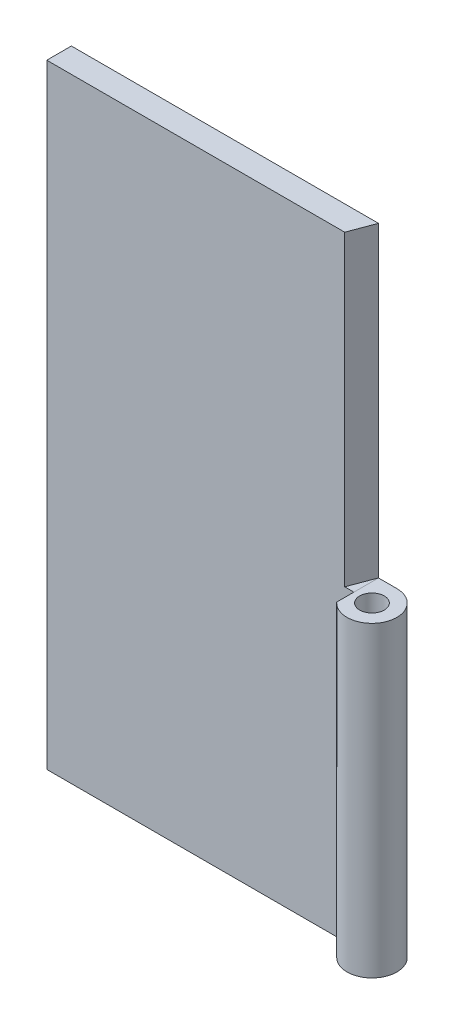
ISO-10303-21;
HEADER;
FILE_DESCRIPTION(('STEP AP214'),'2;1');
FILE_NAME('part.step','',(''),(''),'','','');
FILE_SCHEMA(('AUTOMOTIVE_DESIGN { 1 0 10303 214 1 1 1 1 }'));
ENDSEC;
DATA;
#1=APPLICATION_CONTEXT('core data for automotive mechanical design processes');
#2=APPLICATION_PROTOCOL_DEFINITION('international standard','automotive_design',2000,#1);
#3=PRODUCT_CONTEXT('',#1,'mechanical');
#4=PRODUCT('Part','Part','',(#3));
#5=PRODUCT_RELATED_PRODUCT_CATEGORY('part','',(#4));
#6=PRODUCT_DEFINITION_FORMATION('','',#4);
#7=PRODUCT_DEFINITION_CONTEXT('part definition',#1,'design');
#8=PRODUCT_DEFINITION('design','',#6,#7);
#9=PRODUCT_DEFINITION_SHAPE('','',#8);
#10=(LENGTH_UNIT() NAMED_UNIT(*) SI_UNIT(.MILLI.,.METRE.));
#11=(NAMED_UNIT(*) PLANE_ANGLE_UNIT() SI_UNIT($,.RADIAN.));
#12=(NAMED_UNIT(*) SI_UNIT($,.STERADIAN.) SOLID_ANGLE_UNIT());
#13=UNCERTAINTY_MEASURE_WITH_UNIT(LENGTH_MEASURE(1.E-05),#10,'distance_accuracy_value','');
#14=(GEOMETRIC_REPRESENTATION_CONTEXT(3) GLOBAL_UNCERTAINTY_ASSIGNED_CONTEXT((#13)) GLOBAL_UNIT_ASSIGNED_CONTEXT((#10,
#11,#12)) REPRESENTATION_CONTEXT('',''));
#15=CARTESIAN_POINT('',(0.,0.,0.));
#16=DIRECTION('',(0.,0.,1.));
#17=DIRECTION('',(1.,0.,0.));
#18=AXIS2_PLACEMENT_3D('',#15,#16,#17);
#19=CARTESIAN_POINT('',(25.,-25.,3.4));
#20=DIRECTION('',(-1.,0.,0.));
#21=DIRECTION('',(0.,0.,1.));
#22=AXIS2_PLACEMENT_3D('',#19,#20,#21);
#23=PLANE('',#22);
#24=DIRECTION('',(0.,0.,-1.));
#25=VECTOR('',#24,1.);
#26=CARTESIAN_POINT('',(25.,-50.,3.4));
#27=LINE('',#26,#25);
#28=CARTESIAN_POINT('',(25.,-50.,3.4));
#29=VERTEX_POINT('',#28);
#30=CARTESIAN_POINT('',(25.,-50.,0.));
#31=VERTEX_POINT('',#30);
#32=EDGE_CURVE('E104',#29,#31,#27,.T.);
#33=ORIENTED_EDGE('',*,*,#32,.F.);
#34=DIRECTION('',(0.,-1.,0.));
#35=VECTOR('',#34,1.);
#36=CARTESIAN_POINT('',(25.,-25.,3.4));
#37=LINE('',#36,#35);
#38=CARTESIAN_POINT('',(25.,-25.,3.4));
#39=VERTEX_POINT('',#38);
#40=EDGE_CURVE('E12',#39,#29,#37,.T.);
#41=ORIENTED_EDGE('',*,*,#40,.F.);
#42=DIRECTION('',(0.,0.,-1.));
#43=VECTOR('',#42,1.);
#44=CARTESIAN_POINT('',(25.,-25.,3.4));
#45=LINE('',#44,#43);
#46=CARTESIAN_POINT('',(25.,-25.,0.));
#47=VERTEX_POINT('',#46);
#48=EDGE_CURVE('E93',#39,#47,#45,.T.);
#49=ORIENTED_EDGE('',*,*,#48,.T.);
#50=DIRECTION('',(0.,-1.,0.));
#51=VECTOR('',#50,1.);
#52=CARTESIAN_POINT('',(25.,-25.,0.));
#53=LINE('',#52,#51);
#54=EDGE_CURVE('E52',#47,#31,#53,.T.);
#55=ORIENTED_EDGE('',*,*,#54,.T.);
#56=EDGE_LOOP('',(#33,#41,#49,#55));
#57=FACE_BOUND('',#56,.T.);
#58=ADVANCED_FACE('F49',(#57),#23,.T.);
#59=CARTESIAN_POINT('',(26.5,-25.,2.03088235294118));
#60=DIRECTION('',(0.,-1.,0.));
#61=DIRECTION('',(0.,0.,-1.));
#62=AXIS2_PLACEMENT_3D('',#59,#60,#61);
#63=CYLINDRICAL_SURFACE('',#62,2.03088235294118);
#64=CARTESIAN_POINT('',(26.5,-50.,2.03088235294118));
#65=DIRECTION('',(0.,-1.,0.));
#66=DIRECTION('',(0.,0.,-1.));
#67=AXIS2_PLACEMENT_3D('',#64,#65,#66);
#68=CIRCLE('',#67,2.03088235294118);
#69=CARTESIAN_POINT('',(26.5,-50.,0.));
#70=VERTEX_POINT('',#69);
#71=EDGE_CURVE('E95',#70,#29,#68,.T.);
#72=ORIENTED_EDGE('',*,*,#71,.F.);
#73=DIRECTION('',(0.,-1.,0.));
#74=VECTOR('',#73,1.);
#75=CARTESIAN_POINT('',(26.5,-25.,0.));
#76=LINE('',#75,#74);
#77=CARTESIAN_POINT('',(26.5,-25.,0.));
#78=VERTEX_POINT('',#77);
#79=EDGE_CURVE('E58',#78,#70,#76,.T.);
#80=ORIENTED_EDGE('',*,*,#79,.F.);
#81=CARTESIAN_POINT('',(26.5,-25.,2.03088235294118));
#82=DIRECTION('',(0.,-1.,0.));
#83=DIRECTION('',(0.,0.,-1.));
#84=AXIS2_PLACEMENT_3D('',#81,#82,#83);
#85=CIRCLE('',#84,2.03088235294118);
#86=EDGE_CURVE('E90',#78,#39,#85,.T.);
#87=ORIENTED_EDGE('',*,*,#86,.T.);
#88=ORIENTED_EDGE('',*,*,#40,.T.);
#89=EDGE_LOOP('',(#72,#80,#87,#88));
#90=FACE_BOUND('',#89,.T.);
#91=ADVANCED_FACE('F108',(#90),#63,.T.);
#92=CARTESIAN_POINT('',(25.,-25.,0.));
#93=DIRECTION('',(0.,0.,-1.));
#94=DIRECTION('',(-1.,0.,0.));
#95=AXIS2_PLACEMENT_3D('',#92,#93,#94);
#96=PLANE('',#95);
#97=DIRECTION('',(1.,0.,0.));
#98=VECTOR('',#97,1.);
#99=CARTESIAN_POINT('',(25.,-50.,0.));
#100=LINE('',#99,#98);
#101=EDGE_CURVE('E88',#31,#70,#100,.T.);
#102=ORIENTED_EDGE('',*,*,#101,.F.);
#103=ORIENTED_EDGE('',*,*,#54,.F.);
#104=DIRECTION('',(1.,0.,0.));
#105=VECTOR('',#104,1.);
#106=CARTESIAN_POINT('',(25.,-25.,0.));
#107=LINE('',#106,#105);
#108=EDGE_CURVE('E86',#47,#78,#107,.T.);
#109=ORIENTED_EDGE('',*,*,#108,.T.);
#110=ORIENTED_EDGE('',*,*,#79,.T.);
#111=EDGE_LOOP('',(#102,#103,#109,#110));
#112=FACE_BOUND('',#111,.T.);
#113=ADVANCED_FACE('F85',(#112),#96,.T.);
#114=CARTESIAN_POINT('',(26.5,-25.,2.03088235294118));
#115=DIRECTION('',(0.,-1.,0.));
#116=DIRECTION('',(0.,0.,-1.));
#117=AXIS2_PLACEMENT_3D('',#114,#115,#116);
#118=PLANE('',#117);
#119=CARTESIAN_POINT('',(26.5,-25.,2.03088235294118));
#120=DIRECTION('',(0.,-1.,0.));
#121=DIRECTION('',(0.,0.,-1.));
#122=AXIS2_PLACEMENT_3D('',#119,#120,#121);
#123=CIRCLE('',#122,1.);
#124=CARTESIAN_POINT('',(26.5,-25.,1.03088235294118));
#125=VERTEX_POINT('',#124);
#126=EDGE_CURVE('E100',#125,#125,#123,.T.);
#127=ORIENTED_EDGE('',*,*,#126,.T.);
#128=EDGE_LOOP('',(#127));
#129=FACE_BOUND('',#128,.T.);
#130=ORIENTED_EDGE('',*,*,#48,.F.);
#131=ORIENTED_EDGE('',*,*,#86,.F.);
#132=ORIENTED_EDGE('',*,*,#108,.F.);
#133=EDGE_LOOP('',(#130,#131,#132));
#134=FACE_BOUND('',#133,.T.);
#135=ADVANCED_FACE('F92',(#129,#134),#118,.F.);
#136=CARTESIAN_POINT('',(26.5,-50.,2.03088235294118));
#137=DIRECTION('',(0.,-1.,0.));
#138=DIRECTION('',(0.,0.,-1.));
#139=AXIS2_PLACEMENT_3D('',#136,#137,#138);
#140=PLANE('',#139);
#141=CARTESIAN_POINT('',(26.5,-50.,2.03088235294118));
#142=DIRECTION('',(0.,-1.,0.));
#143=DIRECTION('',(0.,0.,-1.));
#144=AXIS2_PLACEMENT_3D('',#141,#142,#143);
#145=CIRCLE('',#144,1.);
#146=CARTESIAN_POINT('',(26.5,-50.,1.03088235294118));
#147=VERTEX_POINT('',#146);
#148=EDGE_CURVE('E130',#147,#147,#145,.T.);
#149=ORIENTED_EDGE('',*,*,#148,.F.);
#150=EDGE_LOOP('',(#149));
#151=FACE_BOUND('',#150,.T.);
#152=ORIENTED_EDGE('',*,*,#32,.T.);
#153=ORIENTED_EDGE('',*,*,#101,.T.);
#154=ORIENTED_EDGE('',*,*,#71,.T.);
#155=EDGE_LOOP('',(#152,#153,#154));
#156=FACE_BOUND('',#155,.T.);
#157=ADVANCED_FACE('F107',(#151,#156),#140,.T.);
#158=CARTESIAN_POINT('',(26.5,0.,2.03088235294118));
#159=DIRECTION('',(0.,-1.,0.));
#160=DIRECTION('',(0.,0.,-1.));
#161=AXIS2_PLACEMENT_3D('',#158,#159,#160);
#162=CYLINDRICAL_SURFACE('',#161,1.);
#163=ORIENTED_EDGE('',*,*,#148,.T.);
#164=EDGE_LOOP('',(#163));
#165=FACE_BOUND('',#164,.T.);
#166=ORIENTED_EDGE('',*,*,#126,.F.);
#167=EDGE_LOOP('',(#166));
#168=FACE_BOUND('',#167,.T.);
#169=ADVANCED_FACE('F118',(#165,#168),#162,.F.);
#170=CLOSED_SHELL('',(#58,#91,#113,#135,#157,#169));
#171=MANIFOLD_SOLID_BREP('B2',#170);
#172=CARTESIAN_POINT('',(0.,0.,2.));
#173=DIRECTION('',(1.,0.,0.));
#174=DIRECTION('',(0.,1.,0.));
#175=AXIS2_PLACEMENT_3D('',#172,#173,#174);
#176=PLANE('',#175);
#177=DIRECTION('',(0.,-1.,0.));
#178=VECTOR('',#177,1.);
#179=CARTESIAN_POINT('',(0.,0.,0.));
#180=LINE('',#179,#178);
#181=CARTESIAN_POINT('',(0.,0.,0.));
#182=VERTEX_POINT('',#181);
#183=CARTESIAN_POINT('',(0.,-50.,0.));
#184=VERTEX_POINT('',#183);
#185=EDGE_CURVE('E253',#182,#184,#180,.T.);
#186=ORIENTED_EDGE('',*,*,#185,.T.);
#187=DIRECTION('',(0.,0.,-1.));
#188=VECTOR('',#187,1.);
#189=CARTESIAN_POINT('',(0.,-50.,2.));
#190=LINE('',#189,#188);
#191=CARTESIAN_POINT('',(0.,-50.,2.));
#192=VERTEX_POINT('',#191);
#193=EDGE_CURVE('E47',#192,#184,#190,.T.);
#194=ORIENTED_EDGE('',*,*,#193,.F.);
#195=DIRECTION('',(0.,-1.,0.));
#196=VECTOR('',#195,1.);
#197=CARTESIAN_POINT('',(0.,0.,2.));
#198=LINE('',#197,#196);
#199=CARTESIAN_POINT('',(0.,0.,2.));
#200=VERTEX_POINT('',#199);
#201=EDGE_CURVE('E265',#200,#192,#198,.T.);
#202=ORIENTED_EDGE('',*,*,#201,.F.);
#203=DIRECTION('',(0.,0.,-1.));
#204=VECTOR('',#203,1.);
#205=CARTESIAN_POINT('',(0.,0.,2.));
#206=LINE('',#205,#204);
#207=EDGE_CURVE('E242',#200,#182,#206,.T.);
#208=ORIENTED_EDGE('',*,*,#207,.T.);
#209=EDGE_LOOP('',(#186,#194,#202,#208));
#210=FACE_BOUND('',#209,.T.);
#211=ADVANCED_FACE('F168',(#210),#176,.F.);
#212=CARTESIAN_POINT('',(0.,-50.,2.));
#213=DIRECTION('',(0.,1.,0.));
#214=DIRECTION('',(0.,0.,1.));
#215=AXIS2_PLACEMENT_3D('',#212,#213,#214);
#216=PLANE('',#215);
#217=DIRECTION('',(1.,0.,0.));
#218=VECTOR('',#217,1.);
#219=CARTESIAN_POINT('',(0.,-50.,0.));
#220=LINE('',#219,#218);
#221=CARTESIAN_POINT('',(25.,-50.,0.));
#222=VERTEX_POINT('',#221);
#223=EDGE_CURVE('E257',#184,#222,#220,.T.);
#224=ORIENTED_EDGE('',*,*,#223,.T.);
#225=DIRECTION('',(0.,0.,-1.));
#226=VECTOR('',#225,1.);
#227=CARTESIAN_POINT('',(25.,-50.,2.));
#228=LINE('',#227,#226);
#229=CARTESIAN_POINT('',(25.,-50.,2.));
#230=VERTEX_POINT('',#229);
#231=EDGE_CURVE('E176',#230,#222,#228,.T.);
#232=ORIENTED_EDGE('',*,*,#231,.F.);
#233=DIRECTION('',(1.,0.,0.));
#234=VECTOR('',#233,1.);
#235=CARTESIAN_POINT('',(0.,-50.,2.));
#236=LINE('',#235,#234);
#237=EDGE_CURVE('E215',#192,#230,#236,.T.);
#238=ORIENTED_EDGE('',*,*,#237,.F.);
#239=ORIENTED_EDGE('',*,*,#193,.T.);
#240=EDGE_LOOP('',(#224,#232,#238,#239));
#241=FACE_BOUND('',#240,.T.);
#242=ADVANCED_FACE('F286',(#241),#216,.F.);
#243=CARTESIAN_POINT('',(25.,0.,2.));
#244=DIRECTION('',(-1.,0.,0.));
#245=DIRECTION('',(0.,-1.,0.));
#246=AXIS2_PLACEMENT_3D('',#243,#244,#245);
#247=PLANE('',#246);
#248=DIRECTION('',(0.,1.,0.));
#249=VECTOR('',#248,1.);
#250=CARTESIAN_POINT('',(25.,0.,0.));
#251=LINE('',#250,#249);
#252=CARTESIAN_POINT('',(25.,-25.,0.));
#253=VERTEX_POINT('',#252);
#254=EDGE_CURVE('E260',#222,#253,#251,.T.);
#255=ORIENTED_EDGE('',*,*,#254,.T.);
#256=DIRECTION('',(0.,0.,-1.));
#257=VECTOR('',#256,1.);
#258=CARTESIAN_POINT('',(25.,-25.,2.));
#259=LINE('',#258,#257);
#260=CARTESIAN_POINT('',(25.,-25.,2.));
#261=VERTEX_POINT('',#260);
#262=EDGE_CURVE('E183',#261,#253,#259,.T.);
#263=ORIENTED_EDGE('',*,*,#262,.F.);
#264=DIRECTION('',(0.,1.,0.));
#265=VECTOR('',#264,1.);
#266=CARTESIAN_POINT('',(25.,0.,2.));
#267=LINE('',#266,#265);
#268=EDGE_CURVE('E245',#230,#261,#267,.T.);
#269=ORIENTED_EDGE('',*,*,#268,.F.);
#270=ORIENTED_EDGE('',*,*,#231,.T.);
#271=EDGE_LOOP('',(#255,#263,#269,#270));
#272=FACE_BOUND('',#271,.T.);
#273=ADVANCED_FACE('F271',(#272),#247,.F.);
#274=CARTESIAN_POINT('',(0.,0.,2.));
#275=DIRECTION('',(0.,-1.,0.));
#276=DIRECTION('',(0.,0.,-1.));
#277=AXIS2_PLACEMENT_3D('',#274,#275,#276);
#278=PLANE('',#277);
#279=DIRECTION('',(-1.,0.,0.));
#280=VECTOR('',#279,1.);
#281=CARTESIAN_POINT('',(0.,0.,2.));
#282=LINE('',#281,#280);
#283=CARTESIAN_POINT('',(24.25,0.,2.));
#284=VERTEX_POINT('',#283);
#285=EDGE_CURVE('E192',#284,#200,#282,.T.);
#286=ORIENTED_EDGE('',*,*,#285,.F.);
#287=DIRECTION('',(-0.351123441588392,0.,0.936329177569045));
#288=VECTOR('',#287,1.);
#289=CARTESIAN_POINT('',(25.,0.,0.));
#290=LINE('',#289,#288);
#291=CARTESIAN_POINT('',(25.,0.,0.));
#292=VERTEX_POINT('',#291);
#293=EDGE_CURVE('E227',#292,#284,#290,.T.);
#294=ORIENTED_EDGE('',*,*,#293,.F.);
#295=DIRECTION('',(-1.,0.,0.));
#296=VECTOR('',#295,1.);
#297=CARTESIAN_POINT('',(0.,0.,0.));
#298=LINE('',#297,#296);
#299=EDGE_CURVE('E210',#292,#182,#298,.T.);
#300=ORIENTED_EDGE('',*,*,#299,.T.);
#301=ORIENTED_EDGE('',*,*,#207,.F.);
#302=EDGE_LOOP('',(#286,#294,#300,#301));
#303=FACE_BOUND('',#302,.T.);
#304=ADVANCED_FACE('F241',(#303),#278,.F.);
#305=CARTESIAN_POINT('',(0.,0.,2.));
#306=DIRECTION('',(0.,0.,1.));
#307=DIRECTION('',(1.,0.,0.));
#308=AXIS2_PLACEMENT_3D('',#305,#306,#307);
#309=PLANE('',#308);
#310=DIRECTION('',(1.,0.,0.));
#311=VECTOR('',#310,1.);
#312=CARTESIAN_POINT('',(24.25,-25.,2.));
#313=LINE('',#312,#311);
#314=CARTESIAN_POINT('',(24.25,-25.,2.));
#315=VERTEX_POINT('',#314);
#316=EDGE_CURVE('E237',#315,#261,#313,.T.);
#317=ORIENTED_EDGE('',*,*,#316,.F.);
#318=DIRECTION('',(0.,1.,0.));
#319=VECTOR('',#318,1.);
#320=CARTESIAN_POINT('',(24.25,-27.1360009363294,2.));
#321=LINE('',#320,#319);
#322=EDGE_CURVE('E229',#315,#284,#321,.T.);
#323=ORIENTED_EDGE('',*,*,#322,.T.);
#324=ORIENTED_EDGE('',*,*,#285,.T.);
#325=ORIENTED_EDGE('',*,*,#201,.T.);
#326=ORIENTED_EDGE('',*,*,#237,.T.);
#327=ORIENTED_EDGE('',*,*,#268,.T.);
#328=EDGE_LOOP('',(#317,#323,#324,#325,#326,#327));
#329=FACE_BOUND('',#328,.T.);
#330=ADVANCED_FACE('F235',(#329),#309,.T.);
#331=CARTESIAN_POINT('',(0.,0.,0.));
#332=DIRECTION('',(0.,0.,1.));
#333=DIRECTION('',(1.,0.,0.));
#334=AXIS2_PLACEMENT_3D('',#331,#332,#333);
#335=PLANE('',#334);
#336=ORIENTED_EDGE('',*,*,#185,.F.);
#337=ORIENTED_EDGE('',*,*,#299,.F.);
#338=DIRECTION('',(0.,1.,0.));
#339=VECTOR('',#338,1.);
#340=CARTESIAN_POINT('',(25.,-27.1360009363294,0.));
#341=LINE('',#340,#339);
#342=EDGE_CURVE('E231',#253,#292,#341,.T.);
#343=ORIENTED_EDGE('',*,*,#342,.F.);
#344=ORIENTED_EDGE('',*,*,#254,.F.);
#345=ORIENTED_EDGE('',*,*,#223,.F.);
#346=EDGE_LOOP('',(#336,#337,#343,#344,#345));
#347=FACE_BOUND('',#346,.T.);
#348=ADVANCED_FACE('F274',(#347),#335,.F.);
#349=CARTESIAN_POINT('',(26.5,-25.,2.03088235294118));
#350=DIRECTION('',(0.,-1.,0.));
#351=DIRECTION('',(0.,0.,-1.));
#352=AXIS2_PLACEMENT_3D('',#349,#350,#351);
#353=PLANE('',#352);
#354=ORIENTED_EDGE('',*,*,#316,.T.);
#355=ORIENTED_EDGE('',*,*,#262,.T.);
#356=DIRECTION('',(-0.351123441588392,0.,0.936329177569045));
#357=VECTOR('',#356,1.);
#358=CARTESIAN_POINT('',(25.,-25.,0.));
#359=LINE('',#358,#357);
#360=EDGE_CURVE('E239',#253,#315,#359,.T.);
#361=ORIENTED_EDGE('',*,*,#360,.T.);
#362=EDGE_LOOP('',(#354,#355,#361));
#363=FACE_BOUND('',#362,.T.);
#364=ADVANCED_FACE('F298',(#363),#353,.F.);
#365=CARTESIAN_POINT('',(25.,-27.1360009363294,0.));
#366=DIRECTION('',(-0.936329177569044,0.,-0.351123441588392));
#367=DIRECTION('',(-0.351123441588392,0.,0.936329177569045));
#368=AXIS2_PLACEMENT_3D('',#365,#366,#367);
#369=PLANE('',#368);
#370=ORIENTED_EDGE('',*,*,#342,.T.);
#371=ORIENTED_EDGE('',*,*,#293,.T.);
#372=ORIENTED_EDGE('',*,*,#322,.F.);
#373=ORIENTED_EDGE('',*,*,#360,.F.);
#374=EDGE_LOOP('',(#370,#371,#372,#373));
#375=FACE_BOUND('',#374,.T.);
#376=ADVANCED_FACE('F228',(#375),#369,.F.);
#377=CLOSED_SHELL('',(#211,#242,#273,#304,#330,#348,#364,#376));
#378=MANIFOLD_SOLID_BREP('B6',#377);
#379=ADVANCED_BREP_SHAPE_REPRESENTATION('',(#18,#171,#378),#14);
#380=SHAPE_DEFINITION_REPRESENTATION(#9,#379);
ENDSEC;
END-ISO-10303-21;
